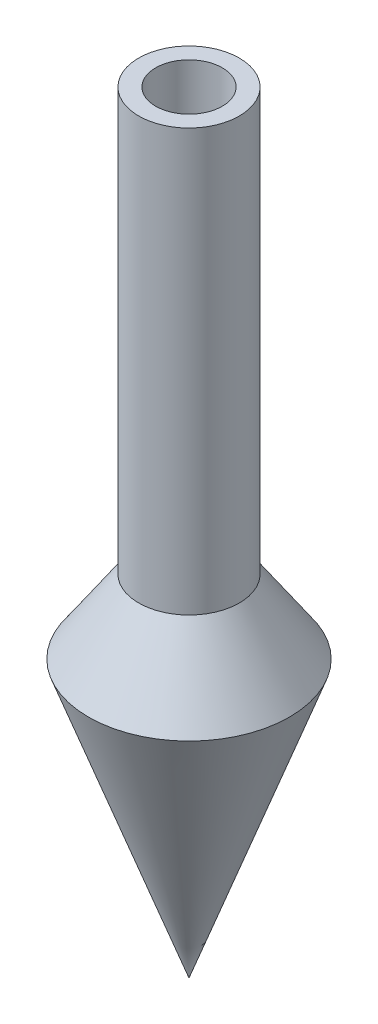
ISO-10303-21;
HEADER;
FILE_DESCRIPTION(('STEP AP214'),'2;1');
FILE_NAME('part.step','',(''),(''),'','','');
FILE_SCHEMA(('AUTOMOTIVE_DESIGN { 1 0 10303 214 1 1 1 1 }'));
ENDSEC;
DATA;
#1=APPLICATION_CONTEXT('core data for automotive mechanical design processes');
#2=APPLICATION_PROTOCOL_DEFINITION('international standard','automotive_design',2000,#1);
#3=PRODUCT_CONTEXT('',#1,'mechanical');
#4=PRODUCT('Part','Part','',(#3));
#5=PRODUCT_RELATED_PRODUCT_CATEGORY('part','',(#4));
#6=PRODUCT_DEFINITION_FORMATION('','',#4);
#7=PRODUCT_DEFINITION_CONTEXT('part definition',#1,'design');
#8=PRODUCT_DEFINITION('design','',#6,#7);
#9=PRODUCT_DEFINITION_SHAPE('','',#8);
#10=(LENGTH_UNIT() NAMED_UNIT(*) SI_UNIT(.MILLI.,.METRE.));
#11=(NAMED_UNIT(*) PLANE_ANGLE_UNIT() SI_UNIT($,.RADIAN.));
#12=(NAMED_UNIT(*) SI_UNIT($,.STERADIAN.) SOLID_ANGLE_UNIT());
#13=UNCERTAINTY_MEASURE_WITH_UNIT(LENGTH_MEASURE(1.E-05),#10,'distance_accuracy_value','');
#14=(GEOMETRIC_REPRESENTATION_CONTEXT(3) GLOBAL_UNCERTAINTY_ASSIGNED_CONTEXT((#13)) GLOBAL_UNIT_ASSIGNED_CONTEXT((#10,
#11,#12)) REPRESENTATION_CONTEXT('',''));
#15=CARTESIAN_POINT('',(0.,0.,0.));
#16=DIRECTION('',(0.,0.,1.));
#17=DIRECTION('',(1.,0.,0.));
#18=AXIS2_PLACEMENT_3D('',#15,#16,#17);
#19=CARTESIAN_POINT('',(0.,0.,0.));
#20=DIRECTION('',(0.,1.,0.));
#21=DIRECTION('',(0.,0.,1.));
#22=AXIS2_PLACEMENT_3D('',#19,#20,#21);
#23=CONICAL_SURFACE('',#22,0.,0.349065850398867);
#24=CARTESIAN_POINT('',(0.,715.98947350076,0.));
#25=DIRECTION('',(0.,-1.,0.));
#26=DIRECTION('',(0.,0.,-1.));
#27=AXIS2_PLACEMENT_3D('',#24,#25,#26);
#28=CIRCLE('',#27,260.598856402207);
#29=CARTESIAN_POINT('',(0.,715.98947350076,-260.598856402207));
#30=VERTEX_POINT('',#29);
#31=EDGE_CURVE('E11',#30,#30,#28,.T.);
#32=ORIENTED_EDGE('',*,*,#31,.T.);
#33=EDGE_LOOP('',(#32));
#34=FACE_BOUND('',#33,.T.);
#35=CARTESIAN_POINT('',(0.,0.,0.));
#36=VERTEX_POINT('',#35);
#37=VERTEX_LOOP('',#36);
#38=FACE_BOUND('',#37,.T.);
#39=ADVANCED_FACE('F43',(#34,#38),#23,.T.);
#40=CARTESIAN_POINT('',(0.,715.98947350076,0.));
#41=DIRECTION('',(0.,-1.,0.));
#42=DIRECTION('',(0.,0.,-1.));
#43=AXIS2_PLACEMENT_3D('',#40,#41,#42);
#44=CONICAL_SURFACE('',#43,260.598856402207,0.599169265894215);
#45=CARTESIAN_POINT('',(0.,906.787546278777,0.));
#46=DIRECTION('',(0.,-1.,0.));
#47=DIRECTION('',(0.,0.,-1.));
#48=AXIS2_PLACEMENT_3D('',#45,#46,#47);
#49=CIRCLE('',#48,130.299428201104);
#50=CARTESIAN_POINT('',(0.,906.787546278777,-130.299428201104));
#51=VERTEX_POINT('',#50);
#52=EDGE_CURVE('E50',#51,#51,#49,.T.);
#53=ORIENTED_EDGE('',*,*,#52,.T.);
#54=EDGE_LOOP('',(#53));
#55=FACE_BOUND('',#54,.T.);
#56=ORIENTED_EDGE('',*,*,#31,.F.);
#57=EDGE_LOOP('',(#56));
#58=FACE_BOUND('',#57,.T.);
#59=ADVANCED_FACE('F54',(#55,#58),#44,.T.);
#60=CARTESIAN_POINT('',(0.,-730.43646352626,0.));
#61=DIRECTION('',(0.,-1.,0.));
#62=DIRECTION('',(0.,0.,-1.));
#63=AXIS2_PLACEMENT_3D('',#60,#61,#62);
#64=CYLINDRICAL_SURFACE('',#63,130.299428201104);
#65=CARTESIAN_POINT('',(0.,2000.,0.));
#66=DIRECTION('',(0.,-1.,0.));
#67=DIRECTION('',(0.,0.,-1.));
#68=AXIS2_PLACEMENT_3D('',#65,#66,#67);
#69=CIRCLE('',#68,130.299428201104);
#70=CARTESIAN_POINT('',(0.,2000.,-130.299428201104));
#71=VERTEX_POINT('',#70);
#72=EDGE_CURVE('E87',#71,#71,#69,.T.);
#73=ORIENTED_EDGE('',*,*,#72,.T.);
#74=EDGE_LOOP('',(#73));
#75=FACE_BOUND('',#74,.T.);
#76=ORIENTED_EDGE('',*,*,#52,.F.);
#77=EDGE_LOOP('',(#76));
#78=FACE_BOUND('',#77,.T.);
#79=ADVANCED_FACE('F59',(#75,#78),#64,.T.);
#80=CARTESIAN_POINT('',(130.299428201104,2000.,0.));
#81=DIRECTION('',(0.,1.,0.));
#82=DIRECTION('',(0.,0.,1.));
#83=AXIS2_PLACEMENT_3D('',#80,#81,#82);
#84=PLANE('',#83);
#85=CARTESIAN_POINT('',(0.,2000.,0.));
#86=DIRECTION('',(0.,1.,0.));
#87=DIRECTION('',(0.,0.,1.));
#88=AXIS2_PLACEMENT_3D('',#85,#86,#87);
#89=CIRCLE('',#88,86.3631990043461);
#90=CARTESIAN_POINT('',(0.,2000.,86.3631990043461));
#91=VERTEX_POINT('',#90);
#92=EDGE_CURVE('E88',#91,#91,#89,.T.);
#93=ORIENTED_EDGE('',*,*,#92,.F.);
#94=EDGE_LOOP('',(#93));
#95=FACE_BOUND('',#94,.T.);
#96=ORIENTED_EDGE('',*,*,#72,.F.);
#97=EDGE_LOOP('',(#96));
#98=FACE_BOUND('',#97,.T.);
#99=ADVANCED_FACE('F66',(#95,#98),#84,.T.);
#100=CARTESIAN_POINT('',(0.,707.000000000001,0.));
#101=DIRECTION('',(0.,1.,0.));
#102=DIRECTION('',(0.,0.,1.));
#103=AXIS2_PLACEMENT_3D('',#100,#101,#102);
#104=CYLINDRICAL_SURFACE('',#103,86.3631990043461);
#105=CARTESIAN_POINT('',(0.,707.000000000001,0.));
#106=DIRECTION('',(0.,1.,0.));
#107=DIRECTION('',(0.,0.,1.));
#108=AXIS2_PLACEMENT_3D('',#105,#106,#107);
#109=CIRCLE('',#108,86.3631990043461);
#110=CARTESIAN_POINT('',(0.,707.000000000001,86.3631990043461));
#111=VERTEX_POINT('',#110);
#112=EDGE_CURVE('E85',#111,#111,#109,.T.);
#113=CARTESIAN_POINT('',(0.,707.000000000001,86.3631990043461));
#114=CARTESIAN_POINT('',(0.,720.468750000001,86.3631990043461));
#115=CARTESIAN_POINT('',(0.,733.9375,86.3631990043461));
#116=CARTESIAN_POINT('',(0.,760.875000000001,86.3631990043461));
#117=CARTESIAN_POINT('',(0.,774.34375,86.3631990043461));
#118=CARTESIAN_POINT('',(0.,801.28125,86.3631990043461));
#119=CARTESIAN_POINT('',(0.,814.75,86.3631990043461));
#120=CARTESIAN_POINT('',(0.,841.6875,86.3631990043461));
#121=CARTESIAN_POINT('',(0.,855.15625,86.3631990043461));
#122=CARTESIAN_POINT('',(0.,882.09375,86.3631990043461));
#123=CARTESIAN_POINT('',(0.,895.5625,86.3631990043461));
#124=CARTESIAN_POINT('',(0.,922.5,86.3631990043461));
#125=CARTESIAN_POINT('',(0.,935.96875,86.3631990043461));
#126=CARTESIAN_POINT('',(0.,962.90625,86.3631990043461));
#127=CARTESIAN_POINT('',(0.,976.375,86.3631990043461));
#128=CARTESIAN_POINT('',(0.,1003.3125,86.3631990043461));
#129=CARTESIAN_POINT('',(0.,1016.78125,86.3631990043461));
#130=CARTESIAN_POINT('',(0.,1043.71875,86.3631990043461));
#131=CARTESIAN_POINT('',(0.,1057.1875,86.3631990043461));
#132=CARTESIAN_POINT('',(0.,1084.125,86.3631990043461));
#133=CARTESIAN_POINT('',(0.,1097.59375,86.3631990043461));
#134=CARTESIAN_POINT('',(0.,1124.53125,86.3631990043461));
#135=CARTESIAN_POINT('',(0.,1138.,86.3631990043461));
#136=CARTESIAN_POINT('',(0.,1164.9375,86.3631990043461));
#137=CARTESIAN_POINT('',(0.,1178.40625,86.3631990043461));
#138=CARTESIAN_POINT('',(0.,1205.34375,86.3631990043461));
#139=CARTESIAN_POINT('',(0.,1218.8125,86.3631990043461));
#140=CARTESIAN_POINT('',(0.,1245.75,86.3631990043461));
#141=CARTESIAN_POINT('',(0.,1259.21875,86.3631990043461));
#142=CARTESIAN_POINT('',(0.,1286.15625,86.3631990043461));
#143=CARTESIAN_POINT('',(0.,1299.625,86.3631990043461));
#144=CARTESIAN_POINT('',(0.,1326.5625,86.3631990043461));
#145=CARTESIAN_POINT('',(0.,1340.03125,86.3631990043461));
#146=CARTESIAN_POINT('',(0.,1366.96875,86.3631990043461));
#147=CARTESIAN_POINT('',(0.,1380.4375,86.3631990043461));
#148=CARTESIAN_POINT('',(0.,1407.375,86.3631990043461));
#149=CARTESIAN_POINT('',(0.,1420.84375,86.3631990043461));
#150=CARTESIAN_POINT('',(0.,1447.78125,86.3631990043461));
#151=CARTESIAN_POINT('',(0.,1461.25,86.3631990043461));
#152=CARTESIAN_POINT('',(0.,1488.1875,86.3631990043461));
#153=CARTESIAN_POINT('',(0.,1501.65625,86.3631990043461));
#154=CARTESIAN_POINT('',(0.,1528.59375,86.3631990043461));
#155=CARTESIAN_POINT('',(0.,1542.0625,86.3631990043461));
#156=CARTESIAN_POINT('',(0.,1569.,86.3631990043461));
#157=CARTESIAN_POINT('',(0.,1582.46875,86.3631990043461));
#158=CARTESIAN_POINT('',(0.,1609.40625,86.3631990043461));
#159=CARTESIAN_POINT('',(0.,1622.875,86.3631990043461));
#160=CARTESIAN_POINT('',(0.,1649.8125,86.3631990043461));
#161=CARTESIAN_POINT('',(0.,1663.28125,86.3631990043461));
#162=CARTESIAN_POINT('',(0.,1690.21875,86.3631990043461));
#163=CARTESIAN_POINT('',(0.,1703.6875,86.3631990043461));
#164=CARTESIAN_POINT('',(0.,1730.625,86.3631990043461));
#165=CARTESIAN_POINT('',(0.,1744.09375,86.3631990043461));
#166=CARTESIAN_POINT('',(0.,1771.03125,86.3631990043461));
#167=CARTESIAN_POINT('',(0.,1784.5,86.3631990043461));
#168=CARTESIAN_POINT('',(0.,1811.4375,86.3631990043461));
#169=CARTESIAN_POINT('',(0.,1824.90625,86.3631990043461));
#170=CARTESIAN_POINT('',(0.,1851.84375,86.3631990043461));
#171=CARTESIAN_POINT('',(0.,1865.3125,86.3631990043461));
#172=CARTESIAN_POINT('',(0.,1892.25,86.3631990043461));
#173=CARTESIAN_POINT('',(0.,1905.71875,86.3631990043461));
#174=CARTESIAN_POINT('',(0.,1932.65625,86.3631990043461));
#175=CARTESIAN_POINT('',(0.,1946.125,86.3631990043461));
#176=CARTESIAN_POINT('',(0.,1973.0625,86.3631990043461));
#177=CARTESIAN_POINT('',(0.,1986.53125,86.3631990043461));
#178=CARTESIAN_POINT('',(0.,2000.,86.3631990043461));
#179=B_SPLINE_CURVE_WITH_KNOTS('',3,(#113,#114,#115,#116,#117,#118,#119,#120,#121,#122,#123,
#124,#125,#126,#127,#128,#129,#130,#131,#132,#133,#134,#135,#136,#137,#138,#139,#140,#141,#142,
#143,#144,#145,#146,#147,#148,#149,#150,#151,#152,#153,#154,#155,#156,#157,#158,#159,#160,#161,
#162,#163,#164,#165,#166,#167,#168,#169,#170,#171,#172,#173,#174,#175,#176,#177,#178),
.UNSPECIFIED.,.F.,.F.,(4,2,2,2,2,2,2,2,2,2,2,2,2,2,2,2,2,2,2,2,2,2,2,2,2,2,2,2,2,2,2,2,4),(0.,
40.40625,80.8125,121.21875,161.625,202.03125,242.4375,282.84375,323.25,363.65625,404.0625,
444.46875,484.875,525.28125,565.6875,606.09375,646.5,686.90625,727.3125,767.71875,808.125,
848.53125,888.9375,929.34375,969.75,1010.15625,1050.5625,1090.96875,1131.375,1171.78125,
1212.1875,1252.59375,1293.),.UNSPECIFIED.);
#180=EDGE_CURVE('BSEAM73',#111,#91,#179,.T.);
#181=ORIENTED_EDGE('',*,*,#112,.F.);
#182=ORIENTED_EDGE('',*,*,#92,.T.);
#183=ORIENTED_EDGE('',*,*,#180,.T.);
#184=ORIENTED_EDGE('',*,*,#180,.F.);
#185=EDGE_LOOP('',(#181,#183,#182,#184));
#186=FACE_BOUND('',#185,.T.);
#187=ADVANCED_FACE('F73',(#186),#104,.F.);
#188=CARTESIAN_POINT('',(0.,707.000000000001,0.));
#189=DIRECTION('',(0.,1.,0.));
#190=DIRECTION('',(0.,0.,1.));
#191=AXIS2_PLACEMENT_3D('',#188,#189,#190);
#192=PLANE('',#191);
#193=ORIENTED_EDGE('',*,*,#112,.T.);
#194=EDGE_LOOP('',(#193));
#195=FACE_BOUND('',#194,.T.);
#196=ADVANCED_FACE('F77',(#195),#192,.T.);
#197=CLOSED_SHELL('',(#39,#59,#79,#99,#187,#196));
#198=MANIFOLD_SOLID_BREP('B2',#197);
#199=ADVANCED_BREP_SHAPE_REPRESENTATION('',(#18,#198),#14);
#200=SHAPE_DEFINITION_REPRESENTATION(#9,#199);
ENDSEC;
END-ISO-10303-21;
